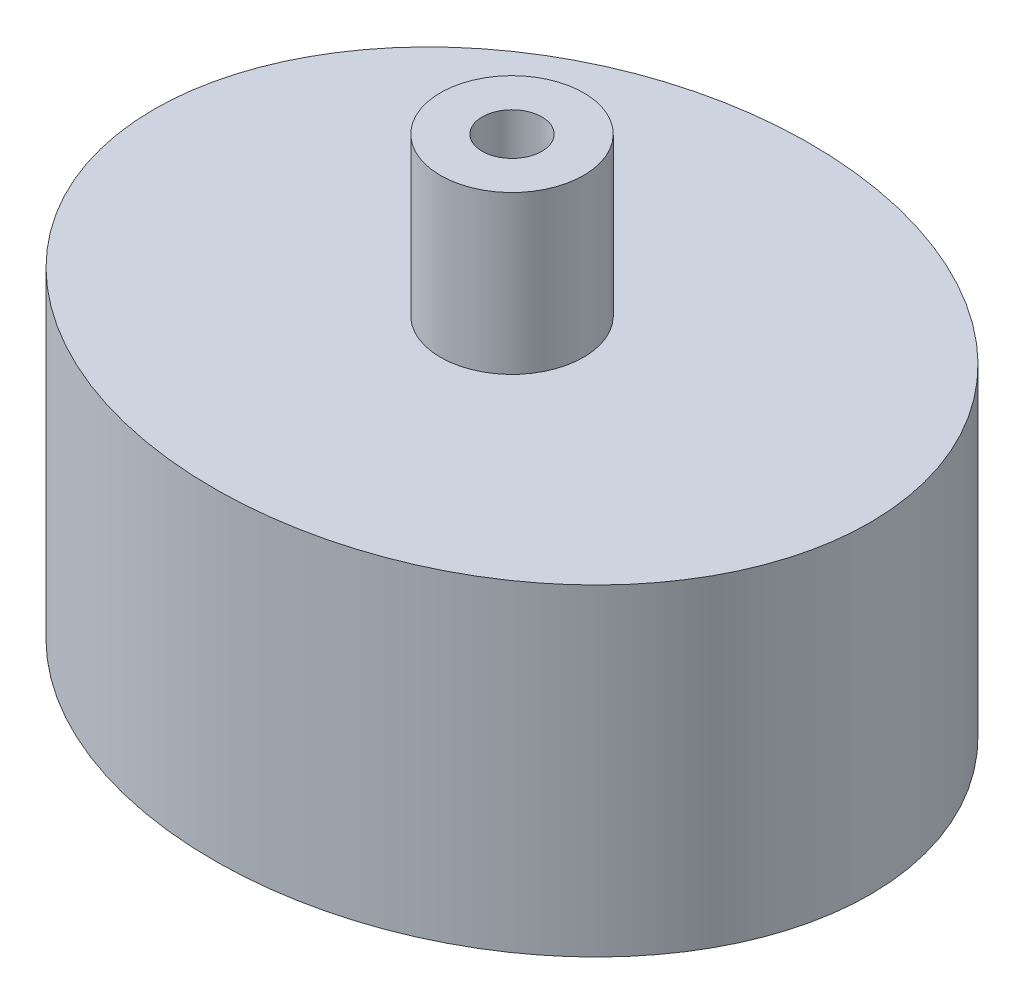
ISO-10303-21;
HEADER;
FILE_DESCRIPTION(('STEP AP214'),'2;1');
FILE_NAME('part.step','',(''),(''),'','','');
FILE_SCHEMA(('AUTOMOTIVE_DESIGN { 1 0 10303 214 1 1 1 1 }'));
ENDSEC;
DATA;
#1=APPLICATION_CONTEXT('core data for automotive mechanical design processes');
#2=APPLICATION_PROTOCOL_DEFINITION('international standard','automotive_design',2000,#1);
#3=PRODUCT_CONTEXT('',#1,'mechanical');
#4=PRODUCT('Part','Part','',(#3));
#5=PRODUCT_RELATED_PRODUCT_CATEGORY('part','',(#4));
#6=PRODUCT_DEFINITION_FORMATION('','',#4);
#7=PRODUCT_DEFINITION_CONTEXT('part definition',#1,'design');
#8=PRODUCT_DEFINITION('design','',#6,#7);
#9=PRODUCT_DEFINITION_SHAPE('','',#8);
#10=(LENGTH_UNIT() NAMED_UNIT(*) SI_UNIT(.MILLI.,.METRE.));
#11=(NAMED_UNIT(*) PLANE_ANGLE_UNIT() SI_UNIT($,.RADIAN.));
#12=(NAMED_UNIT(*) SI_UNIT($,.STERADIAN.) SOLID_ANGLE_UNIT());
#13=UNCERTAINTY_MEASURE_WITH_UNIT(LENGTH_MEASURE(1.E-05),#10,'distance_accuracy_value','');
#14=(GEOMETRIC_REPRESENTATION_CONTEXT(3) GLOBAL_UNCERTAINTY_ASSIGNED_CONTEXT((#13)) GLOBAL_UNIT_ASSIGNED_CONTEXT((#10,
#11,#12)) REPRESENTATION_CONTEXT('',''));
#15=CARTESIAN_POINT('',(0.,0.,0.));
#16=DIRECTION('',(0.,0.,1.));
#17=DIRECTION('',(1.,0.,0.));
#18=AXIS2_PLACEMENT_3D('',#15,#16,#17);
#19=CARTESIAN_POINT('',(0.,5.842,0.));
#20=DIRECTION('',(0.,-1.,0.));
#21=DIRECTION('',(0.,0.,-1.));
#22=AXIS2_PLACEMENT_3D('',#19,#20,#21);
#23=CYLINDRICAL_SURFACE('',#22,25.4);
#24=CARTESIAN_POINT('',(0.,5.842,0.));
#25=DIRECTION('',(0.,1.,0.));
#26=DIRECTION('',(0.,0.,1.));
#27=AXIS2_PLACEMENT_3D('',#24,#25,#26);
#28=CIRCLE('',#27,25.4);
#29=CARTESIAN_POINT('',(0.,5.842,25.4));
#30=VERTEX_POINT('',#29);
#31=EDGE_CURVE('E10',#30,#30,#28,.T.);
#32=ORIENTED_EDGE('',*,*,#31,.F.);
#33=EDGE_LOOP('',(#32));
#34=FACE_BOUND('',#33,.T.);
#35=CARTESIAN_POINT('',(0.,0.,0.));
#36=DIRECTION('',(0.,1.,0.));
#37=DIRECTION('',(0.,0.,1.));
#38=AXIS2_PLACEMENT_3D('',#35,#36,#37);
#39=CIRCLE('',#38,25.4);
#40=CARTESIAN_POINT('',(0.,0.,25.4));
#41=VERTEX_POINT('',#40);
#42=EDGE_CURVE('E34',#41,#41,#39,.T.);
#43=ORIENTED_EDGE('',*,*,#42,.T.);
#44=EDGE_LOOP('',(#43));
#45=FACE_BOUND('',#44,.T.);
#46=ADVANCED_FACE('F31',(#34,#45),#23,.T.);
#47=CARTESIAN_POINT('',(0.,0.,0.));
#48=DIRECTION('',(0.,1.,0.));
#49=DIRECTION('',(0.,0.,1.));
#50=AXIS2_PLACEMENT_3D('',#47,#48,#49);
#51=PLANE('',#50);
#52=CARTESIAN_POINT('',(0.,0.,0.));
#53=DIRECTION('',(0.,1.,0.));
#54=DIRECTION('',(0.,0.,1.));
#55=AXIS2_PLACEMENT_3D('',#52,#53,#54);
#56=CIRCLE('',#55,6.35);
#57=CARTESIAN_POINT('',(0.,0.,6.35));
#58=VERTEX_POINT('',#57);
#59=EDGE_CURVE('E70',#58,#58,#56,.T.);
#60=ORIENTED_EDGE('',*,*,#59,.T.);
#61=EDGE_LOOP('',(#60));
#62=FACE_BOUND('',#61,.T.);
#63=ORIENTED_EDGE('',*,*,#42,.F.);
#64=EDGE_LOOP('',(#63));
#65=FACE_BOUND('',#64,.T.);
#66=ADVANCED_FACE('F57',(#62,#65),#51,.F.);
#67=CARTESIAN_POINT('',(0.,74.422,0.));
#68=DIRECTION('',(0.,1.,0.));
#69=DIRECTION('',(-1.,0.,0.));
#70=AXIS2_PLACEMENT_3D('',#67,#68,#69);
#71=ELLIPSE('',#70,76.2,63.5);
#72=DIRECTION('',(0.,-1.,0.));
#73=VECTOR('',#72,1.);
#74=SURFACE_OF_LINEAR_EXTRUSION('',#71,#73);
#75=CARTESIAN_POINT('',(-76.2,74.422,0.));
#76=VERTEX_POINT('',#75);
#77=EDGE_CURVE('E41',#76,#76,#71,.T.);
#78=ORIENTED_EDGE('',*,*,#77,.F.);
#79=EDGE_LOOP('',(#78));
#80=FACE_BOUND('',#79,.T.);
#81=CARTESIAN_POINT('',(0.,5.842,0.));
#82=DIRECTION('',(0.,1.,0.));
#83=DIRECTION('',(-1.,0.,0.));
#84=AXIS2_PLACEMENT_3D('',#81,#82,#83);
#85=ELLIPSE('',#84,76.2,63.5);
#86=CARTESIAN_POINT('',(-76.2,5.842,0.));
#87=VERTEX_POINT('',#86);
#88=EDGE_CURVE('E43',#87,#87,#85,.T.);
#89=ORIENTED_EDGE('',*,*,#88,.T.);
#90=EDGE_LOOP('',(#89));
#91=FACE_BOUND('',#90,.T.);
#92=ADVANCED_FACE('F53',(#80,#91),#74,.F.);
#93=CARTESIAN_POINT('',(0.,74.422,0.));
#94=DIRECTION('',(0.,1.,0.));
#95=DIRECTION('',(0.,0.,1.));
#96=AXIS2_PLACEMENT_3D('',#93,#94,#95);
#97=PLANE('',#96);
#98=CARTESIAN_POINT('',(0.,74.422,0.));
#99=DIRECTION('',(0.,1.,0.));
#100=DIRECTION('',(0.,0.,1.));
#101=AXIS2_PLACEMENT_3D('',#98,#99,#100);
#102=CIRCLE('',#101,15.24);
#103=CARTESIAN_POINT('',(0.,74.422,15.24));
#104=VERTEX_POINT('',#103);
#105=EDGE_CURVE('E50',#104,#104,#102,.T.);
#106=ORIENTED_EDGE('',*,*,#105,.F.);
#107=EDGE_LOOP('',(#106));
#108=FACE_BOUND('',#107,.T.);
#109=ORIENTED_EDGE('',*,*,#77,.T.);
#110=EDGE_LOOP('',(#109));
#111=FACE_BOUND('',#110,.T.);
#112=ADVANCED_FACE('F56',(#108,#111),#97,.T.);
#113=CARTESIAN_POINT('',(0.,5.842,0.));
#114=DIRECTION('',(0.,1.,0.));
#115=DIRECTION('',(0.,0.,1.));
#116=AXIS2_PLACEMENT_3D('',#113,#114,#115);
#117=PLANE('',#116);
#118=ORIENTED_EDGE('',*,*,#31,.T.);
#119=EDGE_LOOP('',(#118));
#120=FACE_BOUND('',#119,.T.);
#121=ORIENTED_EDGE('',*,*,#88,.F.);
#122=EDGE_LOOP('',(#121));
#123=FACE_BOUND('',#122,.T.);
#124=ADVANCED_FACE('F59',(#120,#123),#117,.F.);
#125=CARTESIAN_POINT('',(0.,107.95,0.));
#126=DIRECTION('',(0.,-1.,0.));
#127=DIRECTION('',(0.,0.,-1.));
#128=AXIS2_PLACEMENT_3D('',#125,#126,#127);
#129=CYLINDRICAL_SURFACE('',#128,15.24);
#130=CARTESIAN_POINT('',(0.,107.95,0.));
#131=DIRECTION('',(0.,1.,0.));
#132=DIRECTION('',(0.,0.,1.));
#133=AXIS2_PLACEMENT_3D('',#130,#131,#132);
#134=CIRCLE('',#133,15.24);
#135=CARTESIAN_POINT('',(0.,107.95,15.24));
#136=VERTEX_POINT('',#135);
#137=EDGE_CURVE('E46',#136,#136,#134,.T.);
#138=ORIENTED_EDGE('',*,*,#137,.F.);
#139=EDGE_LOOP('',(#138));
#140=FACE_BOUND('',#139,.T.);
#141=ORIENTED_EDGE('',*,*,#105,.T.);
#142=EDGE_LOOP('',(#141));
#143=FACE_BOUND('',#142,.T.);
#144=ADVANCED_FACE('F84',(#140,#143),#129,.T.);
#145=CARTESIAN_POINT('',(0.,107.95,0.));
#146=DIRECTION('',(0.,1.,0.));
#147=DIRECTION('',(0.,0.,1.));
#148=AXIS2_PLACEMENT_3D('',#145,#146,#147);
#149=PLANE('',#148);
#150=CARTESIAN_POINT('',(0.,107.95,0.));
#151=DIRECTION('',(0.,1.,0.));
#152=DIRECTION('',(0.,0.,1.));
#153=AXIS2_PLACEMENT_3D('',#150,#151,#152);
#154=CIRCLE('',#153,6.35);
#155=CARTESIAN_POINT('',(0.,107.95,6.35));
#156=VERTEX_POINT('',#155);
#157=EDGE_CURVE('E74',#156,#156,#154,.T.);
#158=ORIENTED_EDGE('',*,*,#157,.F.);
#159=EDGE_LOOP('',(#158));
#160=FACE_BOUND('',#159,.T.);
#161=ORIENTED_EDGE('',*,*,#137,.T.);
#162=EDGE_LOOP('',(#161));
#163=FACE_BOUND('',#162,.T.);
#164=ADVANCED_FACE('F82',(#160,#163),#149,.T.);
#165=CARTESIAN_POINT('',(0.,-1.2E-05,0.));
#166=DIRECTION('',(0.,1.,0.));
#167=DIRECTION('',(0.,0.,1.));
#168=AXIS2_PLACEMENT_3D('',#165,#166,#167);
#169=CYLINDRICAL_SURFACE('',#168,6.35);
#170=CARTESIAN_POINT('',(0.,107.95,6.35));
#171=CARTESIAN_POINT('',(0.,106.825520833333,6.35));
#172=CARTESIAN_POINT('',(0.,105.701041666667,6.35));
#173=CARTESIAN_POINT('',(0.,103.452083333333,6.35));
#174=CARTESIAN_POINT('',(0.,102.327604166667,6.35));
#175=CARTESIAN_POINT('',(0.,100.078645833333,6.35));
#176=CARTESIAN_POINT('',(0.,98.9541666666667,6.35));
#177=CARTESIAN_POINT('',(0.,96.7052083333333,6.35));
#178=CARTESIAN_POINT('',(0.,95.5807291666667,6.35));
#179=CARTESIAN_POINT('',(0.,93.3317708333333,6.35));
#180=CARTESIAN_POINT('',(0.,92.2072916666667,6.35));
#181=CARTESIAN_POINT('',(0.,89.9583333333333,6.35));
#182=CARTESIAN_POINT('',(0.,88.8338541666667,6.35));
#183=CARTESIAN_POINT('',(0.,86.5848958333333,6.35));
#184=CARTESIAN_POINT('',(0.,85.4604166666667,6.35));
#185=CARTESIAN_POINT('',(0.,83.2114583333333,6.35));
#186=CARTESIAN_POINT('',(0.,82.0869791666667,6.35));
#187=CARTESIAN_POINT('',(0.,79.8380208333333,6.35));
#188=CARTESIAN_POINT('',(0.,78.7135416666667,6.35));
#189=CARTESIAN_POINT('',(0.,76.4645833333333,6.35));
#190=CARTESIAN_POINT('',(0.,75.3401041666667,6.35));
#191=CARTESIAN_POINT('',(0.,73.0911458333333,6.35));
#192=CARTESIAN_POINT('',(0.,71.9666666666667,6.35));
#193=CARTESIAN_POINT('',(0.,69.7177083333333,6.35));
#194=CARTESIAN_POINT('',(0.,68.5932291666667,6.35));
#195=CARTESIAN_POINT('',(0.,66.3442708333333,6.35));
#196=CARTESIAN_POINT('',(0.,65.2197916666667,6.35));
#197=CARTESIAN_POINT('',(0.,62.9708333333333,6.35));
#198=CARTESIAN_POINT('',(0.,61.8463541666667,6.35));
#199=CARTESIAN_POINT('',(0.,59.5973958333333,6.35));
#200=CARTESIAN_POINT('',(0.,58.4729166666667,6.35));
#201=CARTESIAN_POINT('',(0.,56.2239583333333,6.35));
#202=CARTESIAN_POINT('',(0.,55.0994791666667,6.35));
#203=CARTESIAN_POINT('',(0.,52.8505208333333,6.35));
#204=CARTESIAN_POINT('',(0.,51.7260416666667,6.35));
#205=CARTESIAN_POINT('',(0.,49.4770833333333,6.35));
#206=CARTESIAN_POINT('',(0.,48.3526041666667,6.35));
#207=CARTESIAN_POINT('',(0.,46.1036458333333,6.35));
#208=CARTESIAN_POINT('',(0.,44.9791666666667,6.35));
#209=CARTESIAN_POINT('',(0.,42.7302083333333,6.35));
#210=CARTESIAN_POINT('',(0.,41.6057291666667,6.35));
#211=CARTESIAN_POINT('',(0.,39.3567708333333,6.35));
#212=CARTESIAN_POINT('',(0.,38.2322916666667,6.35));
#213=CARTESIAN_POINT('',(0.,35.9833333333333,6.35));
#214=CARTESIAN_POINT('',(0.,34.8588541666667,6.35));
#215=CARTESIAN_POINT('',(0.,32.6098958333333,6.35));
#216=CARTESIAN_POINT('',(0.,31.4854166666667,6.35));
#217=CARTESIAN_POINT('',(0.,29.2364583333333,6.35));
#218=CARTESIAN_POINT('',(0.,28.1119791666667,6.35));
#219=CARTESIAN_POINT('',(0.,25.8630208333333,6.35));
#220=CARTESIAN_POINT('',(0.,24.7385416666667,6.35));
#221=CARTESIAN_POINT('',(0.,22.4895833333333,6.35));
#222=CARTESIAN_POINT('',(0.,21.3651041666667,6.35));
#223=CARTESIAN_POINT('',(0.,19.1161458333333,6.35));
#224=CARTESIAN_POINT('',(0.,17.9916666666667,6.35));
#225=CARTESIAN_POINT('',(0.,15.7427083333333,6.35));
#226=CARTESIAN_POINT('',(0.,14.6182291666667,6.35));
#227=CARTESIAN_POINT('',(0.,12.3692708333333,6.35));
#228=CARTESIAN_POINT('',(0.,11.2447916666667,6.35));
#229=CARTESIAN_POINT('',(0.,8.99583333333333,6.35));
#230=CARTESIAN_POINT('',(0.,7.87135416666666,6.35));
#231=CARTESIAN_POINT('',(0.,5.62239583333333,6.35));
#232=CARTESIAN_POINT('',(0.,4.49791666666666,6.35));
#233=CARTESIAN_POINT('',(0.,2.24895833333333,6.35));
#234=CARTESIAN_POINT('',(0.,1.12447916666666,6.35));
#235=CARTESIAN_POINT('',(0.,0.,6.35));
#236=B_SPLINE_CURVE_WITH_KNOTS('',3,(#170,#171,#172,#173,#174,#175,#176,#177,#178,#179,#180,
#181,#182,#183,#184,#185,#186,#187,#188,#189,#190,#191,#192,#193,#194,#195,#196,#197,#198,#199,
#200,#201,#202,#203,#204,#205,#206,#207,#208,#209,#210,#211,#212,#213,#214,#215,#216,#217,#218,
#219,#220,#221,#222,#223,#224,#225,#226,#227,#228,#229,#230,#231,#232,#233,#234,#235),
.UNSPECIFIED.,.F.,.F.,(4,2,2,2,2,2,2,2,2,2,2,2,2,2,2,2,2,2,2,2,2,2,2,2,2,2,2,2,2,2,2,2,4),(0.,
3.37343750000001,6.746875,10.1203125,13.49375,16.8671875,20.240625,23.6140625,26.9875,
30.3609375,33.734375,37.1078125,40.48125,43.8546875,47.228125,50.6015625,53.975,57.3484375,
60.721875,64.0953125,67.46875,70.8421875,74.215625,77.5890625,80.9625,84.3359375,87.709375,
91.0828125,94.45625,97.8296875,101.203125,104.5765625,107.95),.UNSPECIFIED.);
#237=EDGE_CURVE('BSEAM112',#156,#58,#236,.T.);
#238=ORIENTED_EDGE('',*,*,#157,.T.);
#239=ORIENTED_EDGE('',*,*,#59,.F.);
#240=ORIENTED_EDGE('',*,*,#237,.T.);
#241=ORIENTED_EDGE('',*,*,#237,.F.);
#242=EDGE_LOOP('',(#238,#240,#239,#241));
#243=FACE_BOUND('',#242,.T.);
#244=ADVANCED_FACE('F112',(#243),#169,.F.);
#245=CLOSED_SHELL('',(#46,#66,#92,#112,#124,#144,#164,#244));
#246=MANIFOLD_SOLID_BREP('B2',#245);
#247=ADVANCED_BREP_SHAPE_REPRESENTATION('',(#18,#246),#14);
#248=SHAPE_DEFINITION_REPRESENTATION(#9,#247);
ENDSEC;
END-ISO-10303-21;
